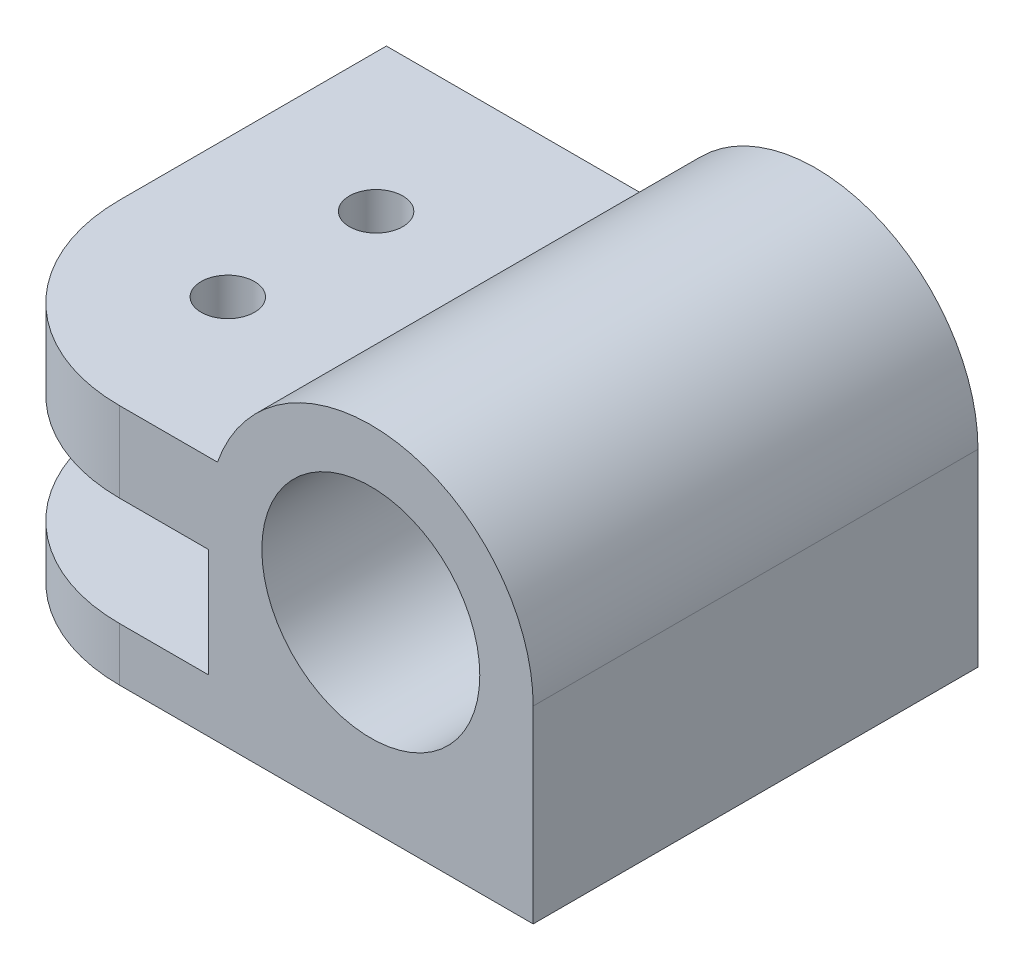
ISO-10303-21;
HEADER;
FILE_DESCRIPTION(('STEP AP214'),'2;1');
FILE_NAME('part.step','',(''),(''),'','','');
FILE_SCHEMA(('AUTOMOTIVE_DESIGN { 1 0 10303 214 1 1 1 1 }'));
ENDSEC;
DATA;
#1=APPLICATION_CONTEXT('core data for automotive mechanical design processes');
#2=APPLICATION_PROTOCOL_DEFINITION('international standard','automotive_design',2000,#1);
#3=PRODUCT_CONTEXT('',#1,'mechanical');
#4=PRODUCT('Part','Part','',(#3));
#5=PRODUCT_RELATED_PRODUCT_CATEGORY('part','',(#4));
#6=PRODUCT_DEFINITION_FORMATION('','',#4);
#7=PRODUCT_DEFINITION_CONTEXT('part definition',#1,'design');
#8=PRODUCT_DEFINITION('design','',#6,#7);
#9=PRODUCT_DEFINITION_SHAPE('','',#8);
#10=(LENGTH_UNIT() NAMED_UNIT(*) SI_UNIT(.MILLI.,.METRE.));
#11=(NAMED_UNIT(*) PLANE_ANGLE_UNIT() SI_UNIT($,.RADIAN.));
#12=(NAMED_UNIT(*) SI_UNIT($,.STERADIAN.) SOLID_ANGLE_UNIT());
#13=UNCERTAINTY_MEASURE_WITH_UNIT(LENGTH_MEASURE(1.E-05),#10,'distance_accuracy_value','');
#14=(GEOMETRIC_REPRESENTATION_CONTEXT(3) GLOBAL_UNCERTAINTY_ASSIGNED_CONTEXT((#13)) GLOBAL_UNIT_ASSIGNED_CONTEXT((#10,
#11,#12)) REPRESENTATION_CONTEXT('',''));
#15=CARTESIAN_POINT('',(0.,0.,0.));
#16=DIRECTION('',(0.,0.,1.));
#17=DIRECTION('',(1.,0.,0.));
#18=AXIS2_PLACEMENT_3D('',#15,#16,#17);
#19=CARTESIAN_POINT('',(-9.125,0.,25.));
#20=DIRECTION('',(1.,0.,0.));
#21=DIRECTION('',(0.,0.,-1.));
#22=AXIS2_PLACEMENT_3D('',#19,#20,#21);
#23=PLANE('',#22);
#24=DIRECTION('',(0.,0.,1.));
#25=VECTOR('',#24,1.);
#26=CARTESIAN_POINT('',(-9.125,-1.50319445433003,25.));
#27=LINE('',#26,#25);
#28=CARTESIAN_POINT('',(-9.125,-1.50319445433003,0.));
#29=VERTEX_POINT('',#28);
#30=CARTESIAN_POINT('',(-9.125,-1.50319445433003,25.));
#31=VERTEX_POINT('',#30);
#32=EDGE_CURVE('E158',#29,#31,#27,.T.);
#33=ORIENTED_EDGE('',*,*,#32,.F.);
#34=DIRECTION('',(0.,-1.,0.));
#35=VECTOR('',#34,1.);
#36=CARTESIAN_POINT('',(-9.125,0.,0.));
#37=LINE('',#36,#35);
#38=CARTESIAN_POINT('',(-9.125,-7.60590961016693,0.));
#39=VERTEX_POINT('',#38);
#40=EDGE_CURVE('E197',#29,#39,#37,.T.);
#41=ORIENTED_EDGE('',*,*,#40,.T.);
#42=DIRECTION('',(0.,0.,-1.));
#43=VECTOR('',#42,1.);
#44=CARTESIAN_POINT('',(-9.125,-7.60590961016693,25.));
#45=LINE('',#44,#43);
#46=CARTESIAN_POINT('',(-9.125,-7.60590961016693,25.));
#47=VERTEX_POINT('',#46);
#48=EDGE_CURVE('E174',#47,#39,#45,.T.);
#49=ORIENTED_EDGE('',*,*,#48,.F.);
#50=DIRECTION('',(0.,-1.,0.));
#51=VECTOR('',#50,1.);
#52=CARTESIAN_POINT('',(-9.125,0.,25.));
#53=LINE('',#52,#51);
#54=EDGE_CURVE('E185',#31,#47,#53,.T.);
#55=ORIENTED_EDGE('',*,*,#54,.F.);
#56=EDGE_LOOP('',(#33,#41,#49,#55));
#57=FACE_BOUND('',#56,.T.);
#58=ADVANCED_FACE('F41',(#57),#23,.F.);
#59=CARTESIAN_POINT('',(0.,0.,25.));
#60=DIRECTION('',(0.,0.,-1.));
#61=DIRECTION('',(-1.,0.,0.));
#62=AXIS2_PLACEMENT_3D('',#59,#60,#61);
#63=CYLINDRICAL_SURFACE('',#62,9.125);
#64=CARTESIAN_POINT('',(0.,0.,0.));
#65=DIRECTION('',(0.,0.,1.));
#66=DIRECTION('',(1.,0.,0.));
#67=AXIS2_PLACEMENT_3D('',#64,#65,#66);
#68=CIRCLE('',#67,9.125);
#69=CARTESIAN_POINT('',(9.125,0.,0.));
#70=VERTEX_POINT('',#69);
#71=CARTESIAN_POINT('',(-8.61775057657159,3.,0.));
#72=VERTEX_POINT('',#71);
#73=EDGE_CURVE('E195',#70,#72,#68,.T.);
#74=ORIENTED_EDGE('',*,*,#73,.T.);
#75=DIRECTION('',(0.,0.,-1.));
#76=VECTOR('',#75,1.);
#77=CARTESIAN_POINT('',(-8.61775057657159,3.,25.));
#78=LINE('',#77,#76);
#79=CARTESIAN_POINT('',(-8.61775057657159,3.,25.));
#80=VERTEX_POINT('',#79);
#81=EDGE_CURVE('E135',#72,#80,#78,.F.);
#82=ORIENTED_EDGE('',*,*,#81,.T.);
#83=CARTESIAN_POINT('',(0.,0.,25.));
#84=DIRECTION('',(0.,0.,1.));
#85=DIRECTION('',(1.,0.,0.));
#86=AXIS2_PLACEMENT_3D('',#83,#84,#85);
#87=CIRCLE('',#86,9.125);
#88=CARTESIAN_POINT('',(9.125,0.,25.));
#89=VERTEX_POINT('',#88);
#90=EDGE_CURVE('E181',#89,#80,#87,.T.);
#91=ORIENTED_EDGE('',*,*,#90,.F.);
#92=DIRECTION('',(0.,0.,-1.));
#93=VECTOR('',#92,1.);
#94=CARTESIAN_POINT('',(9.125,0.,25.));
#95=LINE('',#94,#93);
#96=EDGE_CURVE('E192',#89,#70,#95,.T.);
#97=ORIENTED_EDGE('',*,*,#96,.T.);
#98=EDGE_LOOP('',(#74,#82,#91,#97));
#99=FACE_BOUND('',#98,.T.);
#100=ADVANCED_FACE('F241',(#99),#63,.T.);
#101=CARTESIAN_POINT('',(0.,-10.6059096101669,25.));
#102=DIRECTION('',(0.,1.,0.));
#103=DIRECTION('',(0.,0.,1.));
#104=AXIS2_PLACEMENT_3D('',#101,#102,#103);
#105=PLANE('',#104);
#106=CARTESIAN_POINT('',(-16.37,-10.6059096101669,8.33333333333333));
#107=DIRECTION('',(0.,1.,0.));
#108=DIRECTION('',(0.,0.,1.));
#109=AXIS2_PLACEMENT_3D('',#106,#107,#108);
#110=CIRCLE('',#109,1.5);
#111=CARTESIAN_POINT('',(-16.37,-10.6059096101669,9.83333333333333));
#112=VERTEX_POINT('',#111);
#113=EDGE_CURVE('E211',#112,#112,#110,.T.);
#114=ORIENTED_EDGE('',*,*,#113,.T.);
#115=EDGE_LOOP('',(#114));
#116=FACE_BOUND('',#115,.T.);
#117=CARTESIAN_POINT('',(-16.37,-10.6059096101669,16.6666666666667));
#118=DIRECTION('',(0.,1.,0.));
#119=DIRECTION('',(0.,0.,1.));
#120=AXIS2_PLACEMENT_3D('',#117,#118,#119);
#121=CIRCLE('',#120,1.5);
#122=CARTESIAN_POINT('',(-16.37,-10.6059096101669,18.1666666666667));
#123=VERTEX_POINT('',#122);
#124=EDGE_CURVE('E313',#123,#123,#121,.T.);
#125=ORIENTED_EDGE('',*,*,#124,.T.);
#126=EDGE_LOOP('',(#125));
#127=FACE_BOUND('',#126,.T.);
#128=DIRECTION('',(1.,0.,0.));
#129=VECTOR('',#128,1.);
#130=CARTESIAN_POINT('',(0.,-10.6059096101669,25.));
#131=LINE('',#130,#129);
#132=CARTESIAN_POINT('',(-14.125,-10.6059096101669,25.));
#133=VERTEX_POINT('',#132);
#134=CARTESIAN_POINT('',(9.125,-10.6059096101669,25.));
#135=VERTEX_POINT('',#134);
#136=EDGE_CURVE('E187',#133,#135,#131,.T.);
#137=ORIENTED_EDGE('',*,*,#136,.F.);
#138=CARTESIAN_POINT('',(-14.125,-10.6059096101669,15.));
#139=DIRECTION('',(0.,1.,0.));
#140=DIRECTION('',(0.,0.,1.));
#141=AXIS2_PLACEMENT_3D('',#138,#139,#140);
#142=CIRCLE('',#141,10.);
#143=CARTESIAN_POINT('',(-24.125,-10.6059096101669,15.));
#144=VERTEX_POINT('',#143);
#145=EDGE_CURVE('E63',#133,#144,#142,.F.);
#146=ORIENTED_EDGE('',*,*,#145,.T.);
#147=DIRECTION('',(0.,0.,-1.));
#148=VECTOR('',#147,1.);
#149=CARTESIAN_POINT('',(-24.125,-10.6059096101669,0.));
#150=LINE('',#149,#148);
#151=CARTESIAN_POINT('',(-24.125,-10.6059096101669,0.));
#152=VERTEX_POINT('',#151);
#153=EDGE_CURVE('E161',#144,#152,#150,.T.);
#154=ORIENTED_EDGE('',*,*,#153,.T.);
#155=DIRECTION('',(1.,0.,0.));
#156=VECTOR('',#155,1.);
#157=CARTESIAN_POINT('',(0.,-10.6059096101669,0.));
#158=LINE('',#157,#156);
#159=CARTESIAN_POINT('',(9.125,-10.6059096101669,0.));
#160=VERTEX_POINT('',#159);
#161=EDGE_CURVE('E199',#152,#160,#158,.T.);
#162=ORIENTED_EDGE('',*,*,#161,.T.);
#163=DIRECTION('',(0.,0.,-1.));
#164=VECTOR('',#163,1.);
#165=CARTESIAN_POINT('',(9.125,-10.6059096101669,25.));
#166=LINE('',#165,#164);
#167=EDGE_CURVE('E204',#135,#160,#166,.T.);
#168=ORIENTED_EDGE('',*,*,#167,.F.);
#169=EDGE_LOOP('',(#137,#146,#154,#162,#168));
#170=FACE_BOUND('',#169,.T.);
#171=ADVANCED_FACE('F247',(#116,#127,#170),#105,.F.);
#172=CARTESIAN_POINT('',(0.,0.,25.));
#173=DIRECTION('',(0.,0.,-1.));
#174=DIRECTION('',(-1.,0.,0.));
#175=AXIS2_PLACEMENT_3D('',#172,#173,#174);
#176=CYLINDRICAL_SURFACE('',#175,6.125);
#177=CARTESIAN_POINT('',(0.,0.,25.));
#178=DIRECTION('',(0.,0.,1.));
#179=DIRECTION('',(1.,0.,0.));
#180=AXIS2_PLACEMENT_3D('',#177,#178,#179);
#181=CIRCLE('',#180,6.125);
#182=CARTESIAN_POINT('',(6.125,0.,25.));
#183=VERTEX_POINT('',#182);
#184=EDGE_CURVE('E178',#183,#183,#181,.T.);
#185=ORIENTED_EDGE('',*,*,#184,.T.);
#186=EDGE_LOOP('',(#185));
#187=FACE_BOUND('',#186,.T.);
#188=CARTESIAN_POINT('',(0.,0.,0.));
#189=DIRECTION('',(0.,0.,1.));
#190=DIRECTION('',(1.,0.,0.));
#191=AXIS2_PLACEMENT_3D('',#188,#189,#190);
#192=CIRCLE('',#191,6.125);
#193=CARTESIAN_POINT('',(6.125,0.,0.));
#194=VERTEX_POINT('',#193);
#195=EDGE_CURVE('E177',#194,#194,#192,.T.);
#196=ORIENTED_EDGE('',*,*,#195,.F.);
#197=EDGE_LOOP('',(#196));
#198=FACE_BOUND('',#197,.T.);
#199=ADVANCED_FACE('F271',(#187,#198),#176,.F.);
#200=CARTESIAN_POINT('',(9.125,0.,25.));
#201=DIRECTION('',(1.,0.,0.));
#202=DIRECTION('',(0.,0.,-1.));
#203=AXIS2_PLACEMENT_3D('',#200,#201,#202);
#204=PLANE('',#203);
#205=ORIENTED_EDGE('',*,*,#167,.T.);
#206=DIRECTION('',(0.,-1.,0.));
#207=VECTOR('',#206,1.);
#208=CARTESIAN_POINT('',(9.125,0.,0.));
#209=LINE('',#208,#207);
#210=EDGE_CURVE('E182',#70,#160,#209,.T.);
#211=ORIENTED_EDGE('',*,*,#210,.F.);
#212=ORIENTED_EDGE('',*,*,#96,.F.);
#213=DIRECTION('',(0.,-1.,0.));
#214=VECTOR('',#213,1.);
#215=CARTESIAN_POINT('',(9.125,0.,25.));
#216=LINE('',#215,#214);
#217=EDGE_CURVE('E189',#89,#135,#216,.T.);
#218=ORIENTED_EDGE('',*,*,#217,.T.);
#219=EDGE_LOOP('',(#205,#211,#212,#218));
#220=FACE_BOUND('',#219,.T.);
#221=ADVANCED_FACE('F245',(#220),#204,.T.);
#222=CARTESIAN_POINT('',(0.,0.,25.));
#223=DIRECTION('',(0.,0.,1.));
#224=DIRECTION('',(1.,0.,0.));
#225=AXIS2_PLACEMENT_3D('',#222,#223,#224);
#226=PLANE('',#225);
#227=DIRECTION('',(1.,0.,0.));
#228=VECTOR('',#227,1.);
#229=CARTESIAN_POINT('',(0.,3.,25.));
#230=LINE('',#229,#228);
#231=CARTESIAN_POINT('',(-14.125,3.,25.));
#232=VERTEX_POINT('',#231);
#233=EDGE_CURVE('E144',#232,#80,#230,.T.);
#234=ORIENTED_EDGE('',*,*,#233,.F.);
#235=DIRECTION('',(0.,1.,0.));
#236=VECTOR('',#235,1.);
#237=CARTESIAN_POINT('',(-14.125,0.,25.));
#238=LINE('',#237,#236);
#239=CARTESIAN_POINT('',(-14.125,-1.50319445433003,25.));
#240=VERTEX_POINT('',#239);
#241=EDGE_CURVE('E223',#232,#240,#238,.F.);
#242=ORIENTED_EDGE('',*,*,#241,.T.);
#243=DIRECTION('',(1.,0.,0.));
#244=VECTOR('',#243,1.);
#245=CARTESIAN_POINT('',(0.,-1.50319445433003,25.));
#246=LINE('',#245,#244);
#247=EDGE_CURVE('E151',#240,#31,#246,.T.);
#248=ORIENTED_EDGE('',*,*,#247,.T.);
#249=ORIENTED_EDGE('',*,*,#54,.T.);
#250=DIRECTION('',(-1.,0.,0.));
#251=VECTOR('',#250,1.);
#252=CARTESIAN_POINT('',(9.125,-7.60590961016693,25.));
#253=LINE('',#252,#251);
#254=CARTESIAN_POINT('',(-14.125,-7.60590961016693,25.));
#255=VERTEX_POINT('',#254);
#256=EDGE_CURVE('E162',#47,#255,#253,.T.);
#257=ORIENTED_EDGE('',*,*,#256,.T.);
#258=DIRECTION('',(0.,-1.,0.));
#259=VECTOR('',#258,1.);
#260=CARTESIAN_POINT('',(-14.125,0.,25.));
#261=LINE('',#260,#259);
#262=EDGE_CURVE('E220',#255,#133,#261,.T.);
#263=ORIENTED_EDGE('',*,*,#262,.T.);
#264=ORIENTED_EDGE('',*,*,#136,.T.);
#265=ORIENTED_EDGE('',*,*,#217,.F.);
#266=ORIENTED_EDGE('',*,*,#90,.T.);
#267=EDGE_LOOP('',(#234,#242,#248,#249,#257,#263,#264,#265,#266));
#268=FACE_BOUND('',#267,.T.);
#269=ORIENTED_EDGE('',*,*,#184,.F.);
#270=EDGE_LOOP('',(#269));
#271=FACE_BOUND('',#270,.T.);
#272=ADVANCED_FACE('F236',(#268,#271),#226,.T.);
#273=CARTESIAN_POINT('',(0.,0.,0.));
#274=DIRECTION('',(0.,0.,1.));
#275=DIRECTION('',(1.,0.,0.));
#276=AXIS2_PLACEMENT_3D('',#273,#274,#275);
#277=PLANE('',#276);
#278=ORIENTED_EDGE('',*,*,#40,.F.);
#279=DIRECTION('',(1.,0.,0.));
#280=VECTOR('',#279,1.);
#281=CARTESIAN_POINT('',(0.,-1.50319445433003,0.));
#282=LINE('',#281,#280);
#283=CARTESIAN_POINT('',(-24.125,-1.50319445433003,0.));
#284=VERTEX_POINT('',#283);
#285=EDGE_CURVE('E131',#284,#29,#282,.T.);
#286=ORIENTED_EDGE('',*,*,#285,.F.);
#287=DIRECTION('',(0.,1.,0.));
#288=VECTOR('',#287,1.);
#289=CARTESIAN_POINT('',(-24.125,-1.50319445433003,0.));
#290=LINE('',#289,#288);
#291=CARTESIAN_POINT('',(-24.125,3.,0.));
#292=VERTEX_POINT('',#291);
#293=EDGE_CURVE('E122',#284,#292,#290,.T.);
#294=ORIENTED_EDGE('',*,*,#293,.T.);
#295=DIRECTION('',(1.,0.,0.));
#296=VECTOR('',#295,1.);
#297=CARTESIAN_POINT('',(0.,3.,0.));
#298=LINE('',#297,#296);
#299=EDGE_CURVE('E129',#292,#72,#298,.T.);
#300=ORIENTED_EDGE('',*,*,#299,.T.);
#301=ORIENTED_EDGE('',*,*,#73,.F.);
#302=ORIENTED_EDGE('',*,*,#210,.T.);
#303=ORIENTED_EDGE('',*,*,#161,.F.);
#304=DIRECTION('',(0.,-1.,0.));
#305=VECTOR('',#304,1.);
#306=CARTESIAN_POINT('',(-24.125,-7.60590961016693,0.));
#307=LINE('',#306,#305);
#308=CARTESIAN_POINT('',(-24.125,-7.60590961016693,0.));
#309=VERTEX_POINT('',#308);
#310=EDGE_CURVE('E170',#309,#152,#307,.T.);
#311=ORIENTED_EDGE('',*,*,#310,.F.);
#312=DIRECTION('',(1.,0.,0.));
#313=VECTOR('',#312,1.);
#314=CARTESIAN_POINT('',(9.125,-7.60590961016693,0.));
#315=LINE('',#314,#313);
#316=EDGE_CURVE('E167',#309,#39,#315,.T.);
#317=ORIENTED_EDGE('',*,*,#316,.T.);
#318=EDGE_LOOP('',(#278,#286,#294,#300,#301,#302,#303,#311,#317));
#319=FACE_BOUND('',#318,.T.);
#320=ORIENTED_EDGE('',*,*,#195,.T.);
#321=EDGE_LOOP('',(#320));
#322=FACE_BOUND('',#321,.T.);
#323=ADVANCED_FACE('F125',(#319,#322),#277,.F.);
#324=CARTESIAN_POINT('',(0.,-7.60590961016693,0.));
#325=DIRECTION('',(0.,-1.,0.));
#326=DIRECTION('',(0.,0.,-1.));
#327=AXIS2_PLACEMENT_3D('',#324,#325,#326);
#328=PLANE('',#327);
#329=CARTESIAN_POINT('',(-16.37,-7.60590961016693,8.33333333333333));
#330=DIRECTION('',(0.,-1.,0.));
#331=DIRECTION('',(0.,0.,-1.));
#332=AXIS2_PLACEMENT_3D('',#329,#330,#331);
#333=CIRCLE('',#332,1.5);
#334=CARTESIAN_POINT('',(-16.37,-7.60590961016693,6.83333333333333));
#335=VERTEX_POINT('',#334);
#336=EDGE_CURVE('E145',#335,#335,#333,.T.);
#337=ORIENTED_EDGE('',*,*,#336,.T.);
#338=EDGE_LOOP('',(#337));
#339=FACE_BOUND('',#338,.T.);
#340=CARTESIAN_POINT('',(-16.37,-7.60590961016693,16.6666666666667));
#341=DIRECTION('',(0.,-1.,0.));
#342=DIRECTION('',(0.,0.,-1.));
#343=AXIS2_PLACEMENT_3D('',#340,#341,#342);
#344=CIRCLE('',#343,1.5);
#345=CARTESIAN_POINT('',(-16.37,-7.60590961016693,15.1666666666667));
#346=VERTEX_POINT('',#345);
#347=EDGE_CURVE('E216',#346,#346,#344,.T.);
#348=ORIENTED_EDGE('',*,*,#347,.T.);
#349=EDGE_LOOP('',(#348));
#350=FACE_BOUND('',#349,.T.);
#351=DIRECTION('',(0.,0.,-1.));
#352=VECTOR('',#351,1.);
#353=CARTESIAN_POINT('',(-24.125,-7.60590961016693,0.));
#354=LINE('',#353,#352);
#355=CARTESIAN_POINT('',(-24.125,-7.60590961016693,15.));
#356=VERTEX_POINT('',#355);
#357=EDGE_CURVE('E165',#356,#309,#354,.T.);
#358=ORIENTED_EDGE('',*,*,#357,.F.);
#359=CARTESIAN_POINT('',(-14.125,-7.60590961016693,15.));
#360=DIRECTION('',(0.,-1.,0.));
#361=DIRECTION('',(0.,0.,-1.));
#362=AXIS2_PLACEMENT_3D('',#359,#360,#361);
#363=CIRCLE('',#362,10.);
#364=EDGE_CURVE('E11',#356,#255,#363,.F.);
#365=ORIENTED_EDGE('',*,*,#364,.T.);
#366=ORIENTED_EDGE('',*,*,#256,.F.);
#367=ORIENTED_EDGE('',*,*,#48,.T.);
#368=ORIENTED_EDGE('',*,*,#316,.F.);
#369=EDGE_LOOP('',(#358,#365,#366,#367,#368));
#370=FACE_BOUND('',#369,.T.);
#371=ADVANCED_FACE('F253',(#339,#350,#370),#328,.F.);
#372=CARTESIAN_POINT('',(-24.125,-7.60590961016693,0.));
#373=DIRECTION('',(-1.,0.,0.));
#374=DIRECTION('',(0.,0.,1.));
#375=AXIS2_PLACEMENT_3D('',#372,#373,#374);
#376=PLANE('',#375);
#377=ORIENTED_EDGE('',*,*,#153,.F.);
#378=DIRECTION('',(0.,-1.,0.));
#379=VECTOR('',#378,1.);
#380=CARTESIAN_POINT('',(-24.125,-7.60590961016693,15.));
#381=LINE('',#380,#379);
#382=EDGE_CURVE('E49',#144,#356,#381,.F.);
#383=ORIENTED_EDGE('',*,*,#382,.T.);
#384=ORIENTED_EDGE('',*,*,#357,.T.);
#385=ORIENTED_EDGE('',*,*,#310,.T.);
#386=EDGE_LOOP('',(#377,#383,#384,#385));
#387=FACE_BOUND('',#386,.T.);
#388=ADVANCED_FACE('F250',(#387),#376,.T.);
#389=CARTESIAN_POINT('',(0.,-1.50319445433003,0.));
#390=DIRECTION('',(0.,1.,0.));
#391=DIRECTION('',(0.,0.,1.));
#392=AXIS2_PLACEMENT_3D('',#389,#390,#391);
#393=PLANE('',#392);
#394=CARTESIAN_POINT('',(-16.37,-1.50319445433003,8.33333333333333));
#395=DIRECTION('',(0.,1.,0.));
#396=DIRECTION('',(0.,0.,1.));
#397=AXIS2_PLACEMENT_3D('',#394,#395,#396);
#398=CIRCLE('',#397,1.5);
#399=CARTESIAN_POINT('',(-16.37,-1.50319445433003,9.83333333333333));
#400=VERTEX_POINT('',#399);
#401=EDGE_CURVE('E215',#400,#400,#398,.T.);
#402=ORIENTED_EDGE('',*,*,#401,.T.);
#403=EDGE_LOOP('',(#402));
#404=FACE_BOUND('',#403,.T.);
#405=CARTESIAN_POINT('',(-16.37,-1.50319445433003,16.6666666666667));
#406=DIRECTION('',(0.,1.,0.));
#407=DIRECTION('',(0.,0.,1.));
#408=AXIS2_PLACEMENT_3D('',#405,#406,#407);
#409=CIRCLE('',#408,1.5);
#410=CARTESIAN_POINT('',(-16.37,-1.50319445433003,18.1666666666667));
#411=VERTEX_POINT('',#410);
#412=EDGE_CURVE('E210',#411,#411,#409,.T.);
#413=ORIENTED_EDGE('',*,*,#412,.T.);
#414=EDGE_LOOP('',(#413));
#415=FACE_BOUND('',#414,.T.);
#416=ORIENTED_EDGE('',*,*,#247,.F.);
#417=CARTESIAN_POINT('',(-14.125,-1.50319445433003,15.));
#418=DIRECTION('',(0.,1.,0.));
#419=DIRECTION('',(0.,0.,1.));
#420=AXIS2_PLACEMENT_3D('',#417,#418,#419);
#421=CIRCLE('',#420,10.);
#422=CARTESIAN_POINT('',(-24.125,-1.50319445433003,15.));
#423=VERTEX_POINT('',#422);
#424=EDGE_CURVE('E225',#240,#423,#421,.F.);
#425=ORIENTED_EDGE('',*,*,#424,.T.);
#426=DIRECTION('',(0.,0.,1.));
#427=VECTOR('',#426,1.);
#428=CARTESIAN_POINT('',(-24.125,-1.50319445433003,0.));
#429=LINE('',#428,#427);
#430=EDGE_CURVE('E149',#284,#423,#429,.T.);
#431=ORIENTED_EDGE('',*,*,#430,.F.);
#432=ORIENTED_EDGE('',*,*,#285,.T.);
#433=ORIENTED_EDGE('',*,*,#32,.T.);
#434=EDGE_LOOP('',(#416,#425,#431,#432,#433));
#435=FACE_BOUND('',#434,.T.);
#436=ADVANCED_FACE('F230',(#404,#415,#435),#393,.F.);
#437=CARTESIAN_POINT('',(0.,3.,0.));
#438=DIRECTION('',(0.,1.,0.));
#439=DIRECTION('',(0.,0.,1.));
#440=AXIS2_PLACEMENT_3D('',#437,#438,#439);
#441=PLANE('',#440);
#442=CARTESIAN_POINT('',(-16.37,3.,8.33333333333333));
#443=DIRECTION('',(0.,1.,0.));
#444=DIRECTION('',(0.,0.,1.));
#445=AXIS2_PLACEMENT_3D('',#442,#443,#444);
#446=CIRCLE('',#445,1.5);
#447=CARTESIAN_POINT('',(-16.37,3.,9.83333333333333));
#448=VERTEX_POINT('',#447);
#449=EDGE_CURVE('E212',#448,#448,#446,.T.);
#450=ORIENTED_EDGE('',*,*,#449,.F.);
#451=EDGE_LOOP('',(#450));
#452=FACE_BOUND('',#451,.T.);
#453=CARTESIAN_POINT('',(-16.37,3.,16.6666666666667));
#454=DIRECTION('',(0.,1.,0.));
#455=DIRECTION('',(0.,0.,1.));
#456=AXIS2_PLACEMENT_3D('',#453,#454,#455);
#457=CIRCLE('',#456,1.5);
#458=CARTESIAN_POINT('',(-16.37,3.,18.1666666666667));
#459=VERTEX_POINT('',#458);
#460=EDGE_CURVE('E207',#459,#459,#457,.T.);
#461=ORIENTED_EDGE('',*,*,#460,.F.);
#462=EDGE_LOOP('',(#461));
#463=FACE_BOUND('',#462,.T.);
#464=DIRECTION('',(0.,0.,1.));
#465=VECTOR('',#464,1.);
#466=CARTESIAN_POINT('',(-24.125,3.,0.));
#467=LINE('',#466,#465);
#468=CARTESIAN_POINT('',(-24.125,3.,15.));
#469=VERTEX_POINT('',#468);
#470=EDGE_CURVE('E139',#292,#469,#467,.T.);
#471=ORIENTED_EDGE('',*,*,#470,.T.);
#472=CARTESIAN_POINT('',(-14.125,3.,15.));
#473=DIRECTION('',(0.,1.,0.));
#474=DIRECTION('',(0.,0.,1.));
#475=AXIS2_PLACEMENT_3D('',#472,#473,#474);
#476=CIRCLE('',#475,10.);
#477=EDGE_CURVE('E218',#469,#232,#476,.T.);
#478=ORIENTED_EDGE('',*,*,#477,.T.);
#479=ORIENTED_EDGE('',*,*,#233,.T.);
#480=ORIENTED_EDGE('',*,*,#81,.F.);
#481=ORIENTED_EDGE('',*,*,#299,.F.);
#482=EDGE_LOOP('',(#471,#478,#479,#480,#481));
#483=FACE_BOUND('',#482,.T.);
#484=ADVANCED_FACE('F147',(#452,#463,#483),#441,.T.);
#485=CARTESIAN_POINT('',(-24.125,-1.50319445433003,0.));
#486=DIRECTION('',(-1.,0.,0.));
#487=DIRECTION('',(0.,0.,1.));
#488=AXIS2_PLACEMENT_3D('',#485,#486,#487);
#489=PLANE('',#488);
#490=ORIENTED_EDGE('',*,*,#430,.T.);
#491=DIRECTION('',(0.,1.,0.));
#492=VECTOR('',#491,1.);
#493=CARTESIAN_POINT('',(-24.125,-1.50319445433003,15.));
#494=LINE('',#493,#492);
#495=EDGE_CURVE('E142',#423,#469,#494,.T.);
#496=ORIENTED_EDGE('',*,*,#495,.T.);
#497=ORIENTED_EDGE('',*,*,#470,.F.);
#498=ORIENTED_EDGE('',*,*,#293,.F.);
#499=EDGE_LOOP('',(#490,#496,#497,#498));
#500=FACE_BOUND('',#499,.T.);
#501=ADVANCED_FACE('F140',(#500),#489,.T.);
#502=CARTESIAN_POINT('',(-16.37,-10.6059096101669,16.6666666666667));
#503=DIRECTION('',(0.,1.,0.));
#504=DIRECTION('',(0.,0.,1.));
#505=AXIS2_PLACEMENT_3D('',#502,#503,#504);
#506=CYLINDRICAL_SURFACE('',#505,1.5);
#507=ORIENTED_EDGE('',*,*,#460,.T.);
#508=EDGE_LOOP('',(#507));
#509=FACE_BOUND('',#508,.T.);
#510=ORIENTED_EDGE('',*,*,#412,.F.);
#511=EDGE_LOOP('',(#510));
#512=FACE_BOUND('',#511,.T.);
#513=ADVANCED_FACE('F291',(#509,#512),#506,.F.);
#514=CARTESIAN_POINT('',(-16.37,-10.6059096101669,8.33333333333333));
#515=DIRECTION('',(0.,1.,0.));
#516=DIRECTION('',(0.,0.,1.));
#517=AXIS2_PLACEMENT_3D('',#514,#515,#516);
#518=CYLINDRICAL_SURFACE('',#517,1.5);
#519=ORIENTED_EDGE('',*,*,#449,.T.);
#520=EDGE_LOOP('',(#519));
#521=FACE_BOUND('',#520,.T.);
#522=ORIENTED_EDGE('',*,*,#401,.F.);
#523=EDGE_LOOP('',(#522));
#524=FACE_BOUND('',#523,.T.);
#525=ADVANCED_FACE('F284',(#521,#524),#518,.F.);
#526=ORIENTED_EDGE('',*,*,#124,.F.);
#527=EDGE_LOOP('',(#526));
#528=FACE_BOUND('',#527,.T.);
#529=ORIENTED_EDGE('',*,*,#347,.F.);
#530=EDGE_LOOP('',(#529));
#531=FACE_BOUND('',#530,.T.);
#532=ADVANCED_FACE('F281',(#528,#531),#506,.F.);
#533=ORIENTED_EDGE('',*,*,#113,.F.);
#534=EDGE_LOOP('',(#533));
#535=FACE_BOUND('',#534,.T.);
#536=ORIENTED_EDGE('',*,*,#336,.F.);
#537=EDGE_LOOP('',(#536));
#538=FACE_BOUND('',#537,.T.);
#539=ADVANCED_FACE('F275',(#535,#538),#518,.F.);
#540=CARTESIAN_POINT('',(-14.125,-1.50319445433003,15.));
#541=DIRECTION('',(0.,1.,0.));
#542=DIRECTION('',(0.,0.,1.));
#543=AXIS2_PLACEMENT_3D('',#540,#541,#542);
#544=CYLINDRICAL_SURFACE('',#543,10.);
#545=ORIENTED_EDGE('',*,*,#424,.F.);
#546=ORIENTED_EDGE('',*,*,#241,.F.);
#547=ORIENTED_EDGE('',*,*,#477,.F.);
#548=ORIENTED_EDGE('',*,*,#495,.F.);
#549=EDGE_LOOP('',(#545,#546,#547,#548));
#550=FACE_BOUND('',#549,.T.);
#551=ADVANCED_FACE('F233',(#550),#544,.T.);
#552=CARTESIAN_POINT('',(-14.125,0.,15.));
#553=DIRECTION('',(0.,-1.,0.));
#554=DIRECTION('',(0.,0.,-1.));
#555=AXIS2_PLACEMENT_3D('',#552,#553,#554);
#556=CYLINDRICAL_SURFACE('',#555,10.);
#557=ORIENTED_EDGE('',*,*,#364,.F.);
#558=ORIENTED_EDGE('',*,*,#382,.F.);
#559=ORIENTED_EDGE('',*,*,#145,.F.);
#560=ORIENTED_EDGE('',*,*,#262,.F.);
#561=EDGE_LOOP('',(#557,#558,#559,#560));
#562=FACE_BOUND('',#561,.T.);
#563=ADVANCED_FACE('F43',(#562),#556,.T.);
#564=CLOSED_SHELL('',(#58,#100,#171,#199,#221,#272,#323,#371,#388,#436,#484,#501,#513,#525,#532,
#539,#551,#563));
#565=MANIFOLD_SOLID_BREP('B2',#564);
#566=ADVANCED_BREP_SHAPE_REPRESENTATION('',(#18,#565),#14);
#567=SHAPE_DEFINITION_REPRESENTATION(#9,#566);
ENDSEC;
END-ISO-10303-21;
